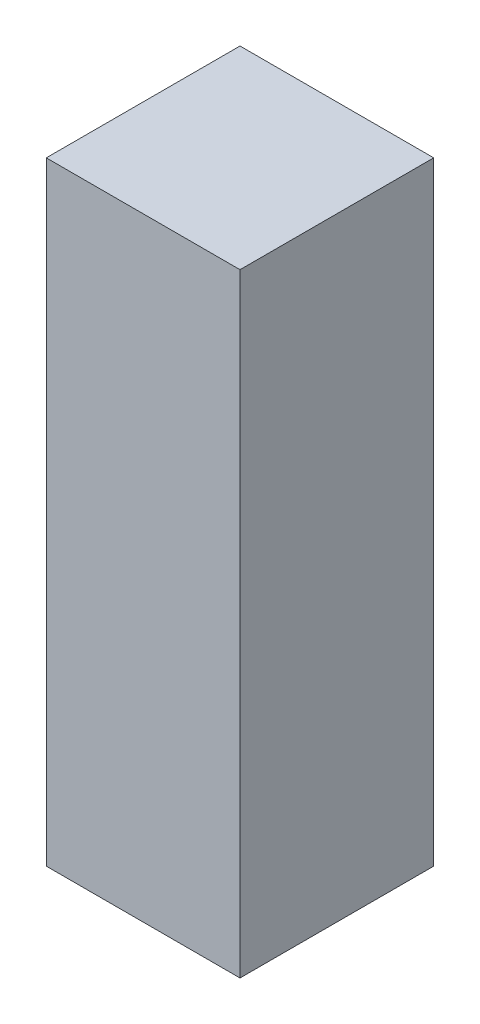
ISO-10303-21;
HEADER;
FILE_DESCRIPTION(('STEP AP214'),'2;1');
FILE_NAME('part.step','',(''),(''),'','','');
FILE_SCHEMA(('AUTOMOTIVE_DESIGN { 1 0 10303 214 1 1 1 1 }'));
ENDSEC;
DATA;
#1=APPLICATION_CONTEXT('core data for automotive mechanical design processes');
#2=APPLICATION_PROTOCOL_DEFINITION('international standard','automotive_design',2000,#1);
#3=PRODUCT_CONTEXT('',#1,'mechanical');
#4=PRODUCT('Part','Part','',(#3));
#5=PRODUCT_RELATED_PRODUCT_CATEGORY('part','',(#4));
#6=PRODUCT_DEFINITION_FORMATION('','',#4);
#7=PRODUCT_DEFINITION_CONTEXT('part definition',#1,'design');
#8=PRODUCT_DEFINITION('design','',#6,#7);
#9=PRODUCT_DEFINITION_SHAPE('','',#8);
#10=(LENGTH_UNIT() NAMED_UNIT(*) SI_UNIT(.MILLI.,.METRE.));
#11=(NAMED_UNIT(*) PLANE_ANGLE_UNIT() SI_UNIT($,.RADIAN.));
#12=(NAMED_UNIT(*) SI_UNIT($,.STERADIAN.) SOLID_ANGLE_UNIT());
#13=UNCERTAINTY_MEASURE_WITH_UNIT(LENGTH_MEASURE(1.E-05),#10,'distance_accuracy_value','');
#14=(GEOMETRIC_REPRESENTATION_CONTEXT(3) GLOBAL_UNCERTAINTY_ASSIGNED_CONTEXT((#13)) GLOBAL_UNIT_ASSIGNED_CONTEXT((#10,
#11,#12)) REPRESENTATION_CONTEXT('',''));
#15=CARTESIAN_POINT('',(0.,0.,0.));
#16=DIRECTION('',(0.,0.,1.));
#17=DIRECTION('',(1.,0.,0.));
#18=AXIS2_PLACEMENT_3D('',#15,#16,#17);
#19=CARTESIAN_POINT('',(0.,0.,48.));
#20=DIRECTION('',(1.,0.,0.));
#21=DIRECTION('',(0.,0.,-1.));
#22=AXIS2_PLACEMENT_3D('',#19,#20,#21);
#23=PLANE('',#22);
#24=DIRECTION('',(0.,-1.,0.));
#25=VECTOR('',#24,1.);
#26=CARTESIAN_POINT('',(0.,0.,0.));
#27=LINE('',#26,#25);
#28=CARTESIAN_POINT('',(0.,152.,0.));
#29=VERTEX_POINT('',#28);
#30=CARTESIAN_POINT('',(0.,0.,0.));
#31=VERTEX_POINT('',#30);
#32=EDGE_CURVE('E96',#29,#31,#27,.T.);
#33=ORIENTED_EDGE('',*,*,#32,.T.);
#34=DIRECTION('',(0.,0.,-1.));
#35=VECTOR('',#34,1.);
#36=CARTESIAN_POINT('',(0.,0.,48.));
#37=LINE('',#36,#35);
#38=CARTESIAN_POINT('',(0.,0.,48.));
#39=VERTEX_POINT('',#38);
#40=EDGE_CURVE('E11',#39,#31,#37,.T.);
#41=ORIENTED_EDGE('',*,*,#40,.F.);
#42=DIRECTION('',(0.,-1.,0.));
#43=VECTOR('',#42,1.);
#44=CARTESIAN_POINT('',(0.,0.,48.));
#45=LINE('',#44,#43);
#46=CARTESIAN_POINT('',(0.,152.,48.));
#47=VERTEX_POINT('',#46);
#48=EDGE_CURVE('E84',#47,#39,#45,.T.);
#49=ORIENTED_EDGE('',*,*,#48,.F.);
#50=DIRECTION('',(0.,0.,-1.));
#51=VECTOR('',#50,1.);
#52=CARTESIAN_POINT('',(0.,152.,48.));
#53=LINE('',#52,#51);
#54=EDGE_CURVE('E92',#47,#29,#53,.T.);
#55=ORIENTED_EDGE('',*,*,#54,.T.);
#56=EDGE_LOOP('',(#33,#41,#49,#55));
#57=FACE_BOUND('',#56,.T.);
#58=ADVANCED_FACE('F33',(#57),#23,.F.);
#59=CARTESIAN_POINT('',(0.,0.,48.));
#60=DIRECTION('',(0.,1.,0.));
#61=DIRECTION('',(0.,0.,1.));
#62=AXIS2_PLACEMENT_3D('',#59,#60,#61);
#63=PLANE('',#62);
#64=DIRECTION('',(1.,0.,0.));
#65=VECTOR('',#64,1.);
#66=CARTESIAN_POINT('',(0.,0.,0.));
#67=LINE('',#66,#65);
#68=CARTESIAN_POINT('',(48.,0.,0.));
#69=VERTEX_POINT('',#68);
#70=EDGE_CURVE('E88',#31,#69,#67,.T.);
#71=ORIENTED_EDGE('',*,*,#70,.T.);
#72=DIRECTION('',(0.,0.,-1.));
#73=VECTOR('',#72,1.);
#74=CARTESIAN_POINT('',(48.,0.,48.));
#75=LINE('',#74,#73);
#76=CARTESIAN_POINT('',(48.,0.,48.));
#77=VERTEX_POINT('',#76);
#78=EDGE_CURVE('E41',#77,#69,#75,.T.);
#79=ORIENTED_EDGE('',*,*,#78,.F.);
#80=DIRECTION('',(1.,0.,0.));
#81=VECTOR('',#80,1.);
#82=CARTESIAN_POINT('',(0.,0.,48.));
#83=LINE('',#82,#81);
#84=EDGE_CURVE('E79',#39,#77,#83,.T.);
#85=ORIENTED_EDGE('',*,*,#84,.F.);
#86=ORIENTED_EDGE('',*,*,#40,.T.);
#87=EDGE_LOOP('',(#71,#79,#85,#86));
#88=FACE_BOUND('',#87,.T.);
#89=ADVANCED_FACE('F87',(#88),#63,.F.);
#90=CARTESIAN_POINT('',(48.,0.,48.));
#91=DIRECTION('',(-1.,0.,0.));
#92=DIRECTION('',(0.,0.,1.));
#93=AXIS2_PLACEMENT_3D('',#90,#91,#92);
#94=PLANE('',#93);
#95=DIRECTION('',(0.,1.,0.));
#96=VECTOR('',#95,1.);
#97=CARTESIAN_POINT('',(48.,0.,0.));
#98=LINE('',#97,#96);
#99=CARTESIAN_POINT('',(48.,152.,0.));
#100=VERTEX_POINT('',#99);
#101=EDGE_CURVE('E66',#69,#100,#98,.T.);
#102=ORIENTED_EDGE('',*,*,#101,.T.);
#103=DIRECTION('',(0.,0.,-1.));
#104=VECTOR('',#103,1.);
#105=CARTESIAN_POINT('',(48.,152.,48.));
#106=LINE('',#105,#104);
#107=CARTESIAN_POINT('',(48.,152.,48.));
#108=VERTEX_POINT('',#107);
#109=EDGE_CURVE('E89',#108,#100,#106,.T.);
#110=ORIENTED_EDGE('',*,*,#109,.F.);
#111=DIRECTION('',(0.,1.,0.));
#112=VECTOR('',#111,1.);
#113=CARTESIAN_POINT('',(48.,0.,48.));
#114=LINE('',#113,#112);
#115=EDGE_CURVE('E82',#77,#108,#114,.T.);
#116=ORIENTED_EDGE('',*,*,#115,.F.);
#117=ORIENTED_EDGE('',*,*,#78,.T.);
#118=EDGE_LOOP('',(#102,#110,#116,#117));
#119=FACE_BOUND('',#118,.T.);
#120=ADVANCED_FACE('F90',(#119),#94,.F.);
#121=CARTESIAN_POINT('',(0.,152.,48.));
#122=DIRECTION('',(0.,-1.,0.));
#123=DIRECTION('',(0.,0.,-1.));
#124=AXIS2_PLACEMENT_3D('',#121,#122,#123);
#125=PLANE('',#124);
#126=DIRECTION('',(-1.,0.,0.));
#127=VECTOR('',#126,1.);
#128=CARTESIAN_POINT('',(0.,152.,0.));
#129=LINE('',#128,#127);
#130=EDGE_CURVE('E72',#100,#29,#129,.T.);
#131=ORIENTED_EDGE('',*,*,#130,.T.);
#132=ORIENTED_EDGE('',*,*,#54,.F.);
#133=DIRECTION('',(-1.,0.,0.));
#134=VECTOR('',#133,1.);
#135=CARTESIAN_POINT('',(0.,152.,48.));
#136=LINE('',#135,#134);
#137=EDGE_CURVE('E49',#108,#47,#136,.T.);
#138=ORIENTED_EDGE('',*,*,#137,.F.);
#139=ORIENTED_EDGE('',*,*,#109,.T.);
#140=EDGE_LOOP('',(#131,#132,#138,#139));
#141=FACE_BOUND('',#140,.T.);
#142=ADVANCED_FACE('F103',(#141),#125,.F.);
#143=CARTESIAN_POINT('',(0.,0.,48.));
#144=DIRECTION('',(0.,0.,-1.));
#145=DIRECTION('',(-1.,0.,0.));
#146=AXIS2_PLACEMENT_3D('',#143,#144,#145);
#147=PLANE('',#146);
#148=ORIENTED_EDGE('',*,*,#48,.T.);
#149=ORIENTED_EDGE('',*,*,#84,.T.);
#150=ORIENTED_EDGE('',*,*,#115,.T.);
#151=ORIENTED_EDGE('',*,*,#137,.T.);
#152=EDGE_LOOP('',(#148,#149,#150,#151));
#153=FACE_BOUND('',#152,.T.);
#154=ADVANCED_FACE('F80',(#153),#147,.F.);
#155=CARTESIAN_POINT('',(0.,0.,0.));
#156=DIRECTION('',(0.,0.,-1.));
#157=DIRECTION('',(-1.,0.,0.));
#158=AXIS2_PLACEMENT_3D('',#155,#156,#157);
#159=PLANE('',#158);
#160=ORIENTED_EDGE('',*,*,#32,.F.);
#161=ORIENTED_EDGE('',*,*,#130,.F.);
#162=ORIENTED_EDGE('',*,*,#101,.F.);
#163=ORIENTED_EDGE('',*,*,#70,.F.);
#164=EDGE_LOOP('',(#160,#161,#162,#163));
#165=FACE_BOUND('',#164,.T.);
#166=ADVANCED_FACE('F106',(#165),#159,.T.);
#167=CLOSED_SHELL('',(#58,#89,#120,#142,#154,#166));
#168=MANIFOLD_SOLID_BREP('B2',#167);
#169=ADVANCED_BREP_SHAPE_REPRESENTATION('',(#18,#168),#14);
#170=SHAPE_DEFINITION_REPRESENTATION(#9,#169);
ENDSEC;
END-ISO-10303-21;
